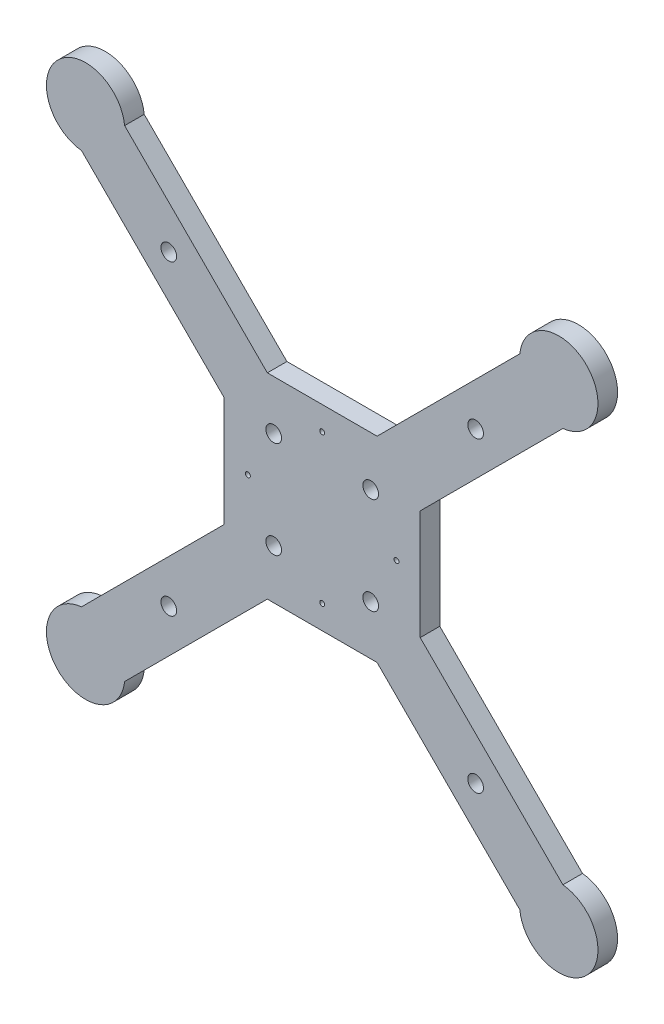
ISO-10303-21;
HEADER;
FILE_DESCRIPTION(('STEP AP214'),'2;1');
FILE_NAME('part.step','',(''),(''),'','','');
FILE_SCHEMA(('AUTOMOTIVE_DESIGN { 1 0 10303 214 1 1 1 1 }'));
ENDSEC;
DATA;
#1=APPLICATION_CONTEXT('core data for automotive mechanical design processes');
#2=APPLICATION_PROTOCOL_DEFINITION('international standard','automotive_design',2000,#1);
#3=PRODUCT_CONTEXT('',#1,'mechanical');
#4=PRODUCT('Part','Part','',(#3));
#5=PRODUCT_RELATED_PRODUCT_CATEGORY('part','',(#4));
#6=PRODUCT_DEFINITION_FORMATION('','',#4);
#7=PRODUCT_DEFINITION_CONTEXT('part definition',#1,'design');
#8=PRODUCT_DEFINITION('design','',#6,#7);
#9=PRODUCT_DEFINITION_SHAPE('','',#8);
#10=(LENGTH_UNIT() NAMED_UNIT(*) SI_UNIT(.MILLI.,.METRE.));
#11=(NAMED_UNIT(*) PLANE_ANGLE_UNIT() SI_UNIT($,.RADIAN.));
#12=(NAMED_UNIT(*) SI_UNIT($,.STERADIAN.) SOLID_ANGLE_UNIT());
#13=UNCERTAINTY_MEASURE_WITH_UNIT(LENGTH_MEASURE(1.E-05),#10,'distance_accuracy_value','');
#14=(GEOMETRIC_REPRESENTATION_CONTEXT(3) GLOBAL_UNCERTAINTY_ASSIGNED_CONTEXT((#13)) GLOBAL_UNIT_ASSIGNED_CONTEXT((#10,
#11,#12)) REPRESENTATION_CONTEXT('',''));
#15=CARTESIAN_POINT('',(0.,0.,0.));
#16=DIRECTION('',(0.,0.,1.));
#17=DIRECTION('',(1.,0.,0.));
#18=AXIS2_PLACEMENT_3D('',#15,#16,#17);
#19=CARTESIAN_POINT('',(120.710678118655,120.710678118654,10.));
#20=DIRECTION('',(0.,0.,-1.));
#21=DIRECTION('',(-1.,0.,0.));
#22=AXIS2_PLACEMENT_3D('',#19,#20,#21);
#23=CYLINDRICAL_SURFACE('',#22,20.0000000000001);
#24=CARTESIAN_POINT('',(120.710678118655,120.710678118654,0.));
#25=DIRECTION('',(0.,0.,1.));
#26=DIRECTION('',(1.,0.,0.));
#27=AXIS2_PLACEMENT_3D('',#24,#25,#26);
#28=CIRCLE('',#27,20.0000000000001);
#29=CARTESIAN_POINT('',(122.822483701339,100.822483701339,0.));
#30=VERTEX_POINT('',#29);
#31=CARTESIAN_POINT('',(100.822483701339,122.822483701339,0.));
#32=VERTEX_POINT('',#31);
#33=EDGE_CURVE('E392',#30,#32,#28,.T.);
#34=ORIENTED_EDGE('',*,*,#33,.T.);
#35=DIRECTION('',(0.,0.,-1.));
#36=VECTOR('',#35,1.);
#37=CARTESIAN_POINT('',(100.822483701339,122.822483701339,10.));
#38=LINE('',#37,#36);
#39=CARTESIAN_POINT('',(100.822483701339,122.822483701339,10.));
#40=VERTEX_POINT('',#39);
#41=EDGE_CURVE('E185',#40,#32,#38,.T.);
#42=ORIENTED_EDGE('',*,*,#41,.F.);
#43=CARTESIAN_POINT('',(120.710678118655,120.710678118654,10.));
#44=DIRECTION('',(0.,0.,1.));
#45=DIRECTION('',(1.,0.,0.));
#46=AXIS2_PLACEMENT_3D('',#43,#44,#45);
#47=CIRCLE('',#46,20.0000000000001);
#48=CARTESIAN_POINT('',(122.822483701339,100.822483701339,10.));
#49=VERTEX_POINT('',#48);
#50=EDGE_CURVE('E383',#49,#40,#47,.T.);
#51=ORIENTED_EDGE('',*,*,#50,.F.);
#52=DIRECTION('',(0.,0.,-1.));
#53=VECTOR('',#52,1.);
#54=CARTESIAN_POINT('',(122.822483701339,100.822483701339,10.));
#55=LINE('',#54,#53);
#56=EDGE_CURVE('E12',#49,#30,#55,.T.);
#57=ORIENTED_EDGE('',*,*,#56,.T.);
#58=EDGE_LOOP('',(#34,#42,#51,#57));
#59=FACE_BOUND('',#58,.T.);
#60=ADVANCED_FACE('F175',(#59),#23,.T.);
#61=CARTESIAN_POINT('',(-11.0000000000001,11.0000000000003,10.));
#62=DIRECTION('',(-0.707106781186544,0.707106781186551,0.));
#63=DIRECTION('',(-0.707106781186551,-0.707106781186544,0.));
#64=AXIS2_PLACEMENT_3D('',#61,#62,#63);
#65=PLANE('',#64);
#66=DIRECTION('',(0.707106781186551,0.707106781186544,0.));
#67=VECTOR('',#66,1.);
#68=CARTESIAN_POINT('',(-11.0000000000001,11.0000000000003,0.));
#69=LINE('',#68,#67);
#70=CARTESIAN_POINT('',(28.,50.,0.));
#71=VERTEX_POINT('',#70);
#72=EDGE_CURVE('E384',#71,#32,#69,.T.);
#73=ORIENTED_EDGE('',*,*,#72,.F.);
#74=DIRECTION('',(0.,0.,-1.));
#75=VECTOR('',#74,1.);
#76=CARTESIAN_POINT('',(28.,50.,10.));
#77=LINE('',#76,#75);
#78=CARTESIAN_POINT('',(28.,50.,10.));
#79=VERTEX_POINT('',#78);
#80=EDGE_CURVE('E398',#79,#71,#77,.T.);
#81=ORIENTED_EDGE('',*,*,#80,.F.);
#82=DIRECTION('',(0.707106781186551,0.707106781186544,0.));
#83=VECTOR('',#82,1.);
#84=CARTESIAN_POINT('',(-11.0000000000001,11.0000000000003,10.));
#85=LINE('',#84,#83);
#86=EDGE_CURVE('E387',#79,#40,#85,.T.);
#87=ORIENTED_EDGE('',*,*,#86,.T.);
#88=ORIENTED_EDGE('',*,*,#41,.T.);
#89=EDGE_LOOP('',(#73,#81,#87,#88));
#90=FACE_BOUND('',#89,.T.);
#91=ADVANCED_FACE('F448',(#90),#65,.T.);
#92=CARTESIAN_POINT('',(10.9999999999997,-10.9999999999998,10.));
#93=DIRECTION('',(0.707106781186544,-0.707106781186551,0.));
#94=DIRECTION('',(0.707106781186551,0.707106781186544,0.));
#95=AXIS2_PLACEMENT_3D('',#92,#93,#94);
#96=PLANE('',#95);
#97=DIRECTION('',(-0.707106781186551,-0.707106781186544,0.));
#98=VECTOR('',#97,1.);
#99=CARTESIAN_POINT('',(10.9999999999997,-10.9999999999998,0.));
#100=LINE('',#99,#98);
#101=CARTESIAN_POINT('',(50.,28.,0.));
#102=VERTEX_POINT('',#101);
#103=EDGE_CURVE('E362',#30,#102,#100,.T.);
#104=ORIENTED_EDGE('',*,*,#103,.F.);
#105=ORIENTED_EDGE('',*,*,#56,.F.);
#106=DIRECTION('',(-0.707106781186551,-0.707106781186544,0.));
#107=VECTOR('',#106,1.);
#108=CARTESIAN_POINT('',(10.9999999999997,-10.9999999999998,10.));
#109=LINE('',#108,#107);
#110=CARTESIAN_POINT('',(50.,28.,10.));
#111=VERTEX_POINT('',#110);
#112=EDGE_CURVE('E380',#49,#111,#109,.T.);
#113=ORIENTED_EDGE('',*,*,#112,.T.);
#114=DIRECTION('',(0.,0.,-1.));
#115=VECTOR('',#114,1.);
#116=CARTESIAN_POINT('',(50.,28.,10.));
#117=LINE('',#116,#115);
#118=EDGE_CURVE('E194',#111,#102,#117,.T.);
#119=ORIENTED_EDGE('',*,*,#118,.T.);
#120=EDGE_LOOP('',(#104,#105,#113,#119));
#121=FACE_BOUND('',#120,.T.);
#122=ADVANCED_FACE('F453',(#121),#96,.T.);
#123=CARTESIAN_POINT('',(0.,0.,0.));
#124=DIRECTION('',(0.,0.,1.));
#125=DIRECTION('',(1.,0.,0.));
#126=AXIS2_PLACEMENT_3D('',#123,#124,#125);
#127=PLANE('',#126);
#128=CARTESIAN_POINT('',(-24.7487373415193,-24.7487373415391,0.));
#129=DIRECTION('',(0.,0.,-1.));
#130=DIRECTION('',(-1.,0.,0.));
#131=AXIS2_PLACEMENT_3D('',#128,#129,#130);
#132=CIRCLE('',#131,4.00000000000001);
#133=CARTESIAN_POINT('',(-28.7487373415193,-24.7487373415391,0.));
#134=VERTEX_POINT('',#133);
#135=EDGE_CURVE('E699',#134,#134,#132,.T.);
#136=ORIENTED_EDGE('',*,*,#135,.F.);
#137=EDGE_LOOP('',(#136));
#138=FACE_BOUND('',#137,.T.);
#139=CARTESIAN_POINT('',(78.2842712474977,-78.2842712474263,0.));
#140=DIRECTION('',(0.,0.,-1.));
#141=DIRECTION('',(-1.,0.,0.));
#142=AXIS2_PLACEMENT_3D('',#139,#140,#141);
#143=CIRCLE('',#142,4.00000000000001);
#144=CARTESIAN_POINT('',(74.2842712474976,-78.2842712474263,0.));
#145=VERTEX_POINT('',#144);
#146=EDGE_CURVE('E705',#145,#145,#143,.T.);
#147=ORIENTED_EDGE('',*,*,#146,.F.);
#148=EDGE_LOOP('',(#147));
#149=FACE_BOUND('',#148,.T.);
#150=CARTESIAN_POINT('',(24.7487373415423,-24.748737341516,0.));
#151=DIRECTION('',(0.,0.,-1.));
#152=DIRECTION('',(-1.,0.,0.));
#153=AXIS2_PLACEMENT_3D('',#150,#151,#152);
#154=CIRCLE('',#153,4.00000000000001);
#155=CARTESIAN_POINT('',(20.7487373415423,-24.748737341516,0.));
#156=VERTEX_POINT('',#155);
#157=EDGE_CURVE('E763',#156,#156,#154,.T.);
#158=ORIENTED_EDGE('',*,*,#157,.F.);
#159=EDGE_LOOP('',(#158));
#160=FACE_BOUND('',#159,.T.);
#161=CARTESIAN_POINT('',(37.92,0.,0.));
#162=DIRECTION('',(0.,0.,-1.));
#163=DIRECTION('',(-1.,0.,0.));
#164=AXIS2_PLACEMENT_3D('',#161,#162,#163);
#165=CIRCLE('',#164,1.25000000000006);
#166=CARTESIAN_POINT('',(36.6699999999999,0.,0.));
#167=VERTEX_POINT('',#166);
#168=EDGE_CURVE('E768',#167,#167,#165,.T.);
#169=ORIENTED_EDGE('',*,*,#168,.F.);
#170=EDGE_LOOP('',(#169));
#171=FACE_BOUND('',#170,.T.);
#172=CARTESIAN_POINT('',(24.7487373415259,24.7487373415324,0.));
#173=DIRECTION('',(0.,0.,-1.));
#174=DIRECTION('',(-1.,0.,0.));
#175=AXIS2_PLACEMENT_3D('',#172,#173,#174);
#176=CIRCLE('',#175,4.00000000000004);
#177=CARTESIAN_POINT('',(20.7487373415258,24.7487373415324,0.));
#178=VERTEX_POINT('',#177);
#179=EDGE_CURVE('E725',#178,#178,#176,.T.);
#180=ORIENTED_EDGE('',*,*,#179,.F.);
#181=EDGE_LOOP('',(#180));
#182=FACE_BOUND('',#181,.T.);
#183=CARTESIAN_POINT('',(-78.2842712474768,78.2842712474472,0.));
#184=DIRECTION('',(0.,0.,-1.));
#185=DIRECTION('',(-1.,0.,0.));
#186=AXIS2_PLACEMENT_3D('',#183,#184,#185);
#187=CIRCLE('',#186,3.99999999999999);
#188=CARTESIAN_POINT('',(-82.2842712474768,78.2842712474472,0.));
#189=VERTEX_POINT('',#188);
#190=EDGE_CURVE('E377',#189,#189,#187,.T.);
#191=ORIENTED_EDGE('',*,*,#190,.F.);
#192=EDGE_LOOP('',(#191));
#193=FACE_BOUND('',#192,.T.);
#194=CARTESIAN_POINT('',(-24.7487373415357,24.7487373415226,0.));
#195=DIRECTION('',(0.,0.,-1.));
#196=DIRECTION('',(-1.,0.,0.));
#197=AXIS2_PLACEMENT_3D('',#194,#195,#196);
#198=CIRCLE('',#197,4.00000000000003);
#199=CARTESIAN_POINT('',(-28.7487373415357,24.7487373415226,0.));
#200=VERTEX_POINT('',#199);
#201=EDGE_CURVE('E715',#200,#200,#198,.T.);
#202=ORIENTED_EDGE('',*,*,#201,.F.);
#203=EDGE_LOOP('',(#202));
#204=FACE_BOUND('',#203,.T.);
#205=CARTESIAN_POINT('',(-78.2842712474368,-78.2842712474872,0.));
#206=DIRECTION('',(0.,0.,-1.));
#207=DIRECTION('',(-1.,0.,0.));
#208=AXIS2_PLACEMENT_3D('',#205,#206,#207);
#209=CIRCLE('',#208,4.00000000000001);
#210=CARTESIAN_POINT('',(-82.2842712474368,-78.2842712474872,0.));
#211=VERTEX_POINT('',#210);
#212=EDGE_CURVE('E702',#211,#211,#209,.T.);
#213=ORIENTED_EDGE('',*,*,#212,.F.);
#214=EDGE_LOOP('',(#213));
#215=FACE_BOUND('',#214,.T.);
#216=CARTESIAN_POINT('',(-1.46328554356032E-13,37.92,0.));
#217=DIRECTION('',(0.,0.,-1.));
#218=DIRECTION('',(-1.,0.,0.));
#219=AXIS2_PLACEMENT_3D('',#216,#217,#218);
#220=CIRCLE('',#219,1.25000000000005);
#221=CARTESIAN_POINT('',(-1.2500000000002,37.92,0.));
#222=VERTEX_POINT('',#221);
#223=EDGE_CURVE('E743',#222,#222,#220,.T.);
#224=ORIENTED_EDGE('',*,*,#223,.F.);
#225=EDGE_LOOP('',(#224));
#226=FACE_BOUND('',#225,.T.);
#227=CARTESIAN_POINT('',(-37.92,-2.87145458143721E-13,0.));
#228=DIRECTION('',(0.,0.,-1.));
#229=DIRECTION('',(-1.,0.,0.));
#230=AXIS2_PLACEMENT_3D('',#227,#228,#229);
#231=CIRCLE('',#230,1.25);
#232=CARTESIAN_POINT('',(-39.17,-2.87145458143721E-13,0.));
#233=VERTEX_POINT('',#232);
#234=EDGE_CURVE('E747',#233,#233,#231,.T.);
#235=ORIENTED_EDGE('',*,*,#234,.F.);
#236=EDGE_LOOP('',(#235));
#237=FACE_BOUND('',#236,.T.);
#238=CARTESIAN_POINT('',(4.36382293350167E-13,-37.92,0.));
#239=DIRECTION('',(0.,0.,-1.));
#240=DIRECTION('',(-1.,0.,0.));
#241=AXIS2_PLACEMENT_3D('',#238,#239,#240);
#242=CIRCLE('',#241,1.25);
#243=CARTESIAN_POINT('',(-1.24999999999956,-37.92,0.));
#244=VERTEX_POINT('',#243);
#245=EDGE_CURVE('E751',#244,#244,#242,.T.);
#246=ORIENTED_EDGE('',*,*,#245,.F.);
#247=EDGE_LOOP('',(#246));
#248=FACE_BOUND('',#247,.T.);
#249=CARTESIAN_POINT('',(78.2842712474577,78.2842712474663,0.));
#250=DIRECTION('',(0.,0.,-1.));
#251=DIRECTION('',(-1.,0.,0.));
#252=AXIS2_PLACEMENT_3D('',#249,#250,#251);
#253=CIRCLE('',#252,4.00000000000008);
#254=CARTESIAN_POINT('',(74.2842712474576,78.2842712474663,0.));
#255=VERTEX_POINT('',#254);
#256=EDGE_CURVE('E369',#255,#255,#253,.T.);
#257=ORIENTED_EDGE('',*,*,#256,.F.);
#258=EDGE_LOOP('',(#257));
#259=FACE_BOUND('',#258,.T.);
#260=DIRECTION('',(0.,1.,0.));
#261=VECTOR('',#260,1.);
#262=CARTESIAN_POINT('',(50.,-50.,0.));
#263=LINE('',#262,#261);
#264=CARTESIAN_POINT('',(50.,-28.,0.));
#265=VERTEX_POINT('',#264);
#266=EDGE_CURVE('E179',#265,#102,#263,.T.);
#267=ORIENTED_EDGE('',*,*,#266,.F.);
#268=DIRECTION('',(-0.707106781186562,0.707106781186533,0.));
#269=VECTOR('',#268,1.);
#270=CARTESIAN_POINT('',(10.999999999999,10.9999999999994,0.));
#271=LINE('',#270,#269);
#272=CARTESIAN_POINT('',(122.822483701341,-100.822483701338,0.));
#273=VERTEX_POINT('',#272);
#274=EDGE_CURVE('E325',#273,#265,#271,.T.);
#275=ORIENTED_EDGE('',*,*,#274,.F.);
#276=CARTESIAN_POINT('',(120.710678118656,-120.710678118653,0.));
#277=DIRECTION('',(0.,0.,1.));
#278=DIRECTION('',(1.,0.,0.));
#279=AXIS2_PLACEMENT_3D('',#276,#277,#278);
#280=CIRCLE('',#279,19.9999999999999);
#281=CARTESIAN_POINT('',(100.822483701341,-122.822483701338,0.));
#282=VERTEX_POINT('',#281);
#283=EDGE_CURVE('E323',#282,#273,#280,.T.);
#284=ORIENTED_EDGE('',*,*,#283,.F.);
#285=DIRECTION('',(0.707106781186562,-0.707106781186534,0.));
#286=VECTOR('',#285,1.);
#287=CARTESIAN_POINT('',(-11.0000000000006,-11.000000000001,0.));
#288=LINE('',#287,#286);
#289=CARTESIAN_POINT('',(28.,-50.,0.));
#290=VERTEX_POINT('',#289);
#291=EDGE_CURVE('E321',#290,#282,#288,.T.);
#292=ORIENTED_EDGE('',*,*,#291,.F.);
#293=DIRECTION('',(-1.,0.,0.));
#294=VECTOR('',#293,1.);
#295=CARTESIAN_POINT('',(0.,-50.,0.));
#296=LINE('',#295,#294);
#297=CARTESIAN_POINT('',(-28.,-50.,0.));
#298=VERTEX_POINT('',#297);
#299=EDGE_CURVE('E313',#290,#298,#296,.T.);
#300=ORIENTED_EDGE('',*,*,#299,.T.);
#301=DIRECTION('',(0.707106781186551,0.707106781186544,0.));
#302=VECTOR('',#301,1.);
#303=CARTESIAN_POINT('',(11.0000000000001,-11.0000000000002,0.));
#304=LINE('',#303,#302);
#305=CARTESIAN_POINT('',(-100.82248370134,-122.822483701339,0.));
#306=VERTEX_POINT('',#305);
#307=EDGE_CURVE('E309',#306,#298,#304,.T.);
#308=ORIENTED_EDGE('',*,*,#307,.F.);
#309=CARTESIAN_POINT('',(-120.710678118655,-120.710678118654,0.));
#310=DIRECTION('',(0.,0.,1.));
#311=DIRECTION('',(1.,0.,0.));
#312=AXIS2_PLACEMENT_3D('',#309,#310,#311);
#313=CIRCLE('',#312,20.);
#314=CARTESIAN_POINT('',(-122.822483701339,-100.822483701339,0.));
#315=VERTEX_POINT('',#314);
#316=EDGE_CURVE('E301',#315,#306,#313,.T.);
#317=ORIENTED_EDGE('',*,*,#316,.F.);
#318=DIRECTION('',(-0.707106781186551,-0.707106781186544,0.));
#319=VECTOR('',#318,1.);
#320=CARTESIAN_POINT('',(-10.9999999999997,10.9999999999999,0.));
#321=LINE('',#320,#319);
#322=CARTESIAN_POINT('',(-50.,-28.,0.));
#323=VERTEX_POINT('',#322);
#324=EDGE_CURVE('E285',#323,#315,#321,.T.);
#325=ORIENTED_EDGE('',*,*,#324,.F.);
#326=DIRECTION('',(0.,1.,0.));
#327=VECTOR('',#326,1.);
#328=CARTESIAN_POINT('',(-50.,0.,0.));
#329=LINE('',#328,#327);
#330=CARTESIAN_POINT('',(-50.,28.,0.));
#331=VERTEX_POINT('',#330);
#332=EDGE_CURVE('E295',#323,#331,#329,.T.);
#333=ORIENTED_EDGE('',*,*,#332,.T.);
#334=DIRECTION('',(-0.707106781186561,0.707106781186534,0.));
#335=VECTOR('',#334,1.);
#336=CARTESIAN_POINT('',(-10.999999999999,-10.9999999999995,0.));
#337=LINE('',#336,#335);
#338=CARTESIAN_POINT('',(-122.82248370134,100.822483701338,0.));
#339=VERTEX_POINT('',#338);
#340=EDGE_CURVE('E334',#331,#339,#337,.T.);
#341=ORIENTED_EDGE('',*,*,#340,.T.);
#342=CARTESIAN_POINT('',(-120.710678118656,120.710678118653,0.));
#343=DIRECTION('',(0.,0.,1.));
#344=DIRECTION('',(1.,0.,0.));
#345=AXIS2_PLACEMENT_3D('',#342,#343,#344);
#346=CIRCLE('',#345,20.);
#347=CARTESIAN_POINT('',(-100.822483701341,122.822483701338,0.));
#348=VERTEX_POINT('',#347);
#349=EDGE_CURVE('E331',#348,#339,#346,.T.);
#350=ORIENTED_EDGE('',*,*,#349,.F.);
#351=DIRECTION('',(0.707106781186562,-0.707106781186534,0.));
#352=VECTOR('',#351,1.);
#353=CARTESIAN_POINT('',(11.0000000000005,11.000000000001,0.));
#354=LINE('',#353,#352);
#355=CARTESIAN_POINT('',(-28.,50.,0.));
#356=VERTEX_POINT('',#355);
#357=EDGE_CURVE('E328',#348,#356,#354,.T.);
#358=ORIENTED_EDGE('',*,*,#357,.T.);
#359=DIRECTION('',(-1.,0.,0.));
#360=VECTOR('',#359,1.);
#361=CARTESIAN_POINT('',(50.,50.,0.));
#362=LINE('',#361,#360);
#363=EDGE_CURVE('E363',#71,#356,#362,.T.);
#364=ORIENTED_EDGE('',*,*,#363,.F.);
#365=ORIENTED_EDGE('',*,*,#72,.T.);
#366=ORIENTED_EDGE('',*,*,#33,.F.);
#367=ORIENTED_EDGE('',*,*,#103,.T.);
#368=EDGE_LOOP('',(#267,#275,#284,#292,#300,#308,#317,#325,#333,#341,#350,#358,#364,#365,#366,#367));
#369=FACE_BOUND('',#368,.T.);
#370=ADVANCED_FACE('F306',(#138,#149,#160,#171,#182,#193,#204,#215,#226,#237,#248,#259,#369),
#127,.F.);
#371=CARTESIAN_POINT('',(0.,0.,10.));
#372=DIRECTION('',(0.,0.,1.));
#373=DIRECTION('',(1.,0.,0.));
#374=AXIS2_PLACEMENT_3D('',#371,#372,#373);
#375=PLANE('',#374);
#376=CARTESIAN_POINT('',(-24.7487373415193,-24.7487373415391,10.));
#377=DIRECTION('',(0.,0.,-1.));
#378=DIRECTION('',(-1.,0.,0.));
#379=AXIS2_PLACEMENT_3D('',#376,#377,#378);
#380=CIRCLE('',#379,4.00000000000001);
#381=CARTESIAN_POINT('',(-28.7487373415193,-24.7487373415391,10.));
#382=VERTEX_POINT('',#381);
#383=EDGE_CURVE('E696',#382,#382,#380,.T.);
#384=ORIENTED_EDGE('',*,*,#383,.T.);
#385=EDGE_LOOP('',(#384));
#386=FACE_BOUND('',#385,.T.);
#387=CARTESIAN_POINT('',(78.2842712474977,-78.2842712474263,10.));
#388=DIRECTION('',(0.,0.,-1.));
#389=DIRECTION('',(-1.,0.,0.));
#390=AXIS2_PLACEMENT_3D('',#387,#388,#389);
#391=CIRCLE('',#390,4.00000000000001);
#392=CARTESIAN_POINT('',(74.2842712474976,-78.2842712474263,10.));
#393=VERTEX_POINT('',#392);
#394=EDGE_CURVE('E700',#393,#393,#391,.T.);
#395=ORIENTED_EDGE('',*,*,#394,.T.);
#396=EDGE_LOOP('',(#395));
#397=FACE_BOUND('',#396,.T.);
#398=CARTESIAN_POINT('',(24.7487373415423,-24.748737341516,10.));
#399=DIRECTION('',(0.,0.,-1.));
#400=DIRECTION('',(-1.,0.,0.));
#401=AXIS2_PLACEMENT_3D('',#398,#399,#400);
#402=CIRCLE('',#401,4.00000000000001);
#403=CARTESIAN_POINT('',(20.7487373415423,-24.748737341516,10.));
#404=VERTEX_POINT('',#403);
#405=EDGE_CURVE('E711',#404,#404,#402,.T.);
#406=ORIENTED_EDGE('',*,*,#405,.T.);
#407=EDGE_LOOP('',(#406));
#408=FACE_BOUND('',#407,.T.);
#409=CARTESIAN_POINT('',(37.92,0.,10.));
#410=DIRECTION('',(0.,0.,-1.));
#411=DIRECTION('',(-1.,0.,0.));
#412=AXIS2_PLACEMENT_3D('',#409,#410,#411);
#413=CIRCLE('',#412,1.25000000000006);
#414=CARTESIAN_POINT('',(36.6699999999999,0.,10.));
#415=VERTEX_POINT('',#414);
#416=EDGE_CURVE('E766',#415,#415,#413,.T.);
#417=ORIENTED_EDGE('',*,*,#416,.T.);
#418=EDGE_LOOP('',(#417));
#419=FACE_BOUND('',#418,.T.);
#420=CARTESIAN_POINT('',(24.7487373415259,24.7487373415324,10.));
#421=DIRECTION('',(0.,0.,-1.));
#422=DIRECTION('',(-1.,0.,0.));
#423=AXIS2_PLACEMENT_3D('',#420,#421,#422);
#424=CIRCLE('',#423,4.00000000000004);
#425=CARTESIAN_POINT('',(20.7487373415258,24.7487373415324,10.));
#426=VERTEX_POINT('',#425);
#427=EDGE_CURVE('E374',#426,#426,#424,.T.);
#428=ORIENTED_EDGE('',*,*,#427,.T.);
#429=EDGE_LOOP('',(#428));
#430=FACE_BOUND('',#429,.T.);
#431=CARTESIAN_POINT('',(-78.2842712474768,78.2842712474472,10.));
#432=DIRECTION('',(0.,0.,-1.));
#433=DIRECTION('',(-1.,0.,0.));
#434=AXIS2_PLACEMENT_3D('',#431,#432,#433);
#435=CIRCLE('',#434,3.99999999999999);
#436=CARTESIAN_POINT('',(-82.2842712474768,78.2842712474472,10.));
#437=VERTEX_POINT('',#436);
#438=EDGE_CURVE('E727',#437,#437,#435,.T.);
#439=ORIENTED_EDGE('',*,*,#438,.T.);
#440=EDGE_LOOP('',(#439));
#441=FACE_BOUND('',#440,.T.);
#442=CARTESIAN_POINT('',(-24.7487373415357,24.7487373415226,10.));
#443=DIRECTION('',(0.,0.,-1.));
#444=DIRECTION('',(-1.,0.,0.));
#445=AXIS2_PLACEMENT_3D('',#442,#443,#444);
#446=CIRCLE('',#445,4.00000000000003);
#447=CARTESIAN_POINT('',(-28.7487373415357,24.7487373415226,10.));
#448=VERTEX_POINT('',#447);
#449=EDGE_CURVE('E712',#448,#448,#446,.T.);
#450=ORIENTED_EDGE('',*,*,#449,.T.);
#451=EDGE_LOOP('',(#450));
#452=FACE_BOUND('',#451,.T.);
#453=CARTESIAN_POINT('',(-78.2842712474368,-78.2842712474872,10.));
#454=DIRECTION('',(0.,0.,-1.));
#455=DIRECTION('',(-1.,0.,0.));
#456=AXIS2_PLACEMENT_3D('',#453,#454,#455);
#457=CIRCLE('',#456,4.00000000000001);
#458=CARTESIAN_POINT('',(-82.2842712474368,-78.2842712474872,10.));
#459=VERTEX_POINT('',#458);
#460=EDGE_CURVE('E718',#459,#459,#457,.T.);
#461=ORIENTED_EDGE('',*,*,#460,.T.);
#462=EDGE_LOOP('',(#461));
#463=FACE_BOUND('',#462,.T.);
#464=CARTESIAN_POINT('',(-1.46328554356032E-13,37.92,10.));
#465=DIRECTION('',(0.,0.,-1.));
#466=DIRECTION('',(-1.,0.,0.));
#467=AXIS2_PLACEMENT_3D('',#464,#465,#466);
#468=CIRCLE('',#467,1.25000000000005);
#469=CARTESIAN_POINT('',(-1.2500000000002,37.92,10.));
#470=VERTEX_POINT('',#469);
#471=EDGE_CURVE('E770',#470,#470,#468,.T.);
#472=ORIENTED_EDGE('',*,*,#471,.T.);
#473=EDGE_LOOP('',(#472));
#474=FACE_BOUND('',#473,.T.);
#475=CARTESIAN_POINT('',(-37.92,-2.87145458143721E-13,10.));
#476=DIRECTION('',(0.,0.,-1.));
#477=DIRECTION('',(-1.,0.,0.));
#478=AXIS2_PLACEMENT_3D('',#475,#476,#477);
#479=CIRCLE('',#478,1.25);
#480=CARTESIAN_POINT('',(-39.17,-2.87145458143721E-13,10.));
#481=VERTEX_POINT('',#480);
#482=EDGE_CURVE('E777',#481,#481,#479,.T.);
#483=ORIENTED_EDGE('',*,*,#482,.T.);
#484=EDGE_LOOP('',(#483));
#485=FACE_BOUND('',#484,.T.);
#486=CARTESIAN_POINT('',(4.36382293350167E-13,-37.92,10.));
#487=DIRECTION('',(0.,0.,-1.));
#488=DIRECTION('',(-1.,0.,0.));
#489=AXIS2_PLACEMENT_3D('',#486,#487,#488);
#490=CIRCLE('',#489,1.25);
#491=CARTESIAN_POINT('',(-1.24999999999956,-37.92,10.));
#492=VERTEX_POINT('',#491);
#493=EDGE_CURVE('E755',#492,#492,#490,.T.);
#494=ORIENTED_EDGE('',*,*,#493,.T.);
#495=EDGE_LOOP('',(#494));
#496=FACE_BOUND('',#495,.T.);
#497=CARTESIAN_POINT('',(78.2842712474577,78.2842712474663,10.));
#498=DIRECTION('',(0.,0.,-1.));
#499=DIRECTION('',(-1.,0.,0.));
#500=AXIS2_PLACEMENT_3D('',#497,#498,#499);
#501=CIRCLE('',#500,4.00000000000008);
#502=CARTESIAN_POINT('',(74.2842712474576,78.2842712474663,10.));
#503=VERTEX_POINT('',#502);
#504=EDGE_CURVE('E364',#503,#503,#501,.T.);
#505=ORIENTED_EDGE('',*,*,#504,.T.);
#506=EDGE_LOOP('',(#505));
#507=FACE_BOUND('',#506,.T.);
#508=DIRECTION('',(-0.707106781186562,0.707106781186533,0.));
#509=VECTOR('',#508,1.);
#510=CARTESIAN_POINT('',(10.999999999999,10.9999999999994,10.));
#511=LINE('',#510,#509);
#512=CARTESIAN_POINT('',(122.822483701341,-100.822483701338,10.));
#513=VERTEX_POINT('',#512);
#514=CARTESIAN_POINT('',(50.,-28.,10.));
#515=VERTEX_POINT('',#514);
#516=EDGE_CURVE('E412',#513,#515,#511,.T.);
#517=ORIENTED_EDGE('',*,*,#516,.T.);
#518=DIRECTION('',(0.,1.,0.));
#519=VECTOR('',#518,1.);
#520=CARTESIAN_POINT('',(50.,-50.,10.));
#521=LINE('',#520,#519);
#522=EDGE_CURVE('E311',#515,#111,#521,.T.);
#523=ORIENTED_EDGE('',*,*,#522,.T.);
#524=ORIENTED_EDGE('',*,*,#112,.F.);
#525=ORIENTED_EDGE('',*,*,#50,.T.);
#526=ORIENTED_EDGE('',*,*,#86,.F.);
#527=DIRECTION('',(-1.,0.,0.));
#528=VECTOR('',#527,1.);
#529=CARTESIAN_POINT('',(50.,50.,10.));
#530=LINE('',#529,#528);
#531=CARTESIAN_POINT('',(-28.,50.,10.));
#532=VERTEX_POINT('',#531);
#533=EDGE_CURVE('E315',#79,#532,#530,.T.);
#534=ORIENTED_EDGE('',*,*,#533,.T.);
#535=DIRECTION('',(0.707106781186562,-0.707106781186534,0.));
#536=VECTOR('',#535,1.);
#537=CARTESIAN_POINT('',(11.0000000000005,11.000000000001,10.));
#538=LINE('',#537,#536);
#539=CARTESIAN_POINT('',(-100.822483701341,122.822483701338,10.));
#540=VERTEX_POINT('',#539);
#541=EDGE_CURVE('E415',#540,#532,#538,.T.);
#542=ORIENTED_EDGE('',*,*,#541,.F.);
#543=CARTESIAN_POINT('',(-120.710678118656,120.710678118653,10.));
#544=DIRECTION('',(0.,0.,1.));
#545=DIRECTION('',(1.,0.,0.));
#546=AXIS2_PLACEMENT_3D('',#543,#544,#545);
#547=CIRCLE('',#546,20.);
#548=CARTESIAN_POINT('',(-122.82248370134,100.822483701338,10.));
#549=VERTEX_POINT('',#548);
#550=EDGE_CURVE('E418',#540,#549,#547,.T.);
#551=ORIENTED_EDGE('',*,*,#550,.T.);
#552=DIRECTION('',(-0.707106781186561,0.707106781186534,0.));
#553=VECTOR('',#552,1.);
#554=CARTESIAN_POINT('',(-10.999999999999,-10.9999999999995,10.));
#555=LINE('',#554,#553);
#556=CARTESIAN_POINT('',(-50.,28.,10.));
#557=VERTEX_POINT('',#556);
#558=EDGE_CURVE('E420',#557,#549,#555,.T.);
#559=ORIENTED_EDGE('',*,*,#558,.F.);
#560=DIRECTION('',(0.,1.,0.));
#561=VECTOR('',#560,1.);
#562=CARTESIAN_POINT('',(-50.,0.,10.));
#563=LINE('',#562,#561);
#564=CARTESIAN_POINT('',(-50.,-28.,10.));
#565=VERTEX_POINT('',#564);
#566=EDGE_CURVE('E422',#565,#557,#563,.T.);
#567=ORIENTED_EDGE('',*,*,#566,.F.);
#568=DIRECTION('',(-0.707106781186551,-0.707106781186544,0.));
#569=VECTOR('',#568,1.);
#570=CARTESIAN_POINT('',(-10.9999999999997,10.9999999999999,10.));
#571=LINE('',#570,#569);
#572=CARTESIAN_POINT('',(-122.822483701339,-100.822483701339,10.));
#573=VERTEX_POINT('',#572);
#574=EDGE_CURVE('E303',#565,#573,#571,.T.);
#575=ORIENTED_EDGE('',*,*,#574,.T.);
#576=CARTESIAN_POINT('',(-120.710678118655,-120.710678118654,10.));
#577=DIRECTION('',(0.,0.,1.));
#578=DIRECTION('',(1.,0.,0.));
#579=AXIS2_PLACEMENT_3D('',#576,#577,#578);
#580=CIRCLE('',#579,20.);
#581=CARTESIAN_POINT('',(-100.82248370134,-122.822483701339,10.));
#582=VERTEX_POINT('',#581);
#583=EDGE_CURVE('E294',#573,#582,#580,.T.);
#584=ORIENTED_EDGE('',*,*,#583,.T.);
#585=DIRECTION('',(0.707106781186551,0.707106781186544,0.));
#586=VECTOR('',#585,1.);
#587=CARTESIAN_POINT('',(11.0000000000001,-11.0000000000002,10.));
#588=LINE('',#587,#586);
#589=CARTESIAN_POINT('',(-28.,-50.,10.));
#590=VERTEX_POINT('',#589);
#591=EDGE_CURVE('E402',#582,#590,#588,.T.);
#592=ORIENTED_EDGE('',*,*,#591,.T.);
#593=DIRECTION('',(-1.,0.,0.));
#594=VECTOR('',#593,1.);
#595=CARTESIAN_POINT('',(0.,-50.,10.));
#596=LINE('',#595,#594);
#597=CARTESIAN_POINT('',(28.,-50.,10.));
#598=VERTEX_POINT('',#597);
#599=EDGE_CURVE('E405',#598,#590,#596,.T.);
#600=ORIENTED_EDGE('',*,*,#599,.F.);
#601=DIRECTION('',(0.707106781186562,-0.707106781186534,0.));
#602=VECTOR('',#601,1.);
#603=CARTESIAN_POINT('',(-11.0000000000006,-11.000000000001,10.));
#604=LINE('',#603,#602);
#605=CARTESIAN_POINT('',(100.822483701341,-122.822483701338,10.));
#606=VERTEX_POINT('',#605);
#607=EDGE_CURVE('E408',#598,#606,#604,.T.);
#608=ORIENTED_EDGE('',*,*,#607,.T.);
#609=CARTESIAN_POINT('',(120.710678118656,-120.710678118653,10.));
#610=DIRECTION('',(0.,0.,1.));
#611=DIRECTION('',(1.,0.,0.));
#612=AXIS2_PLACEMENT_3D('',#609,#610,#611);
#613=CIRCLE('',#612,19.9999999999999);
#614=EDGE_CURVE('E410',#606,#513,#613,.T.);
#615=ORIENTED_EDGE('',*,*,#614,.T.);
#616=EDGE_LOOP('',(#517,#523,#524,#525,#526,#534,#542,#551,#559,#567,#575,#584,#592,#600,#608,#615));
#617=FACE_BOUND('',#616,.T.);
#618=ADVANCED_FACE('F427',(#386,#397,#408,#419,#430,#441,#452,#463,#474,#485,#496,#507,#617),
#375,.T.);
#619=CARTESIAN_POINT('',(-120.710678118655,-120.710678118654,10.));
#620=DIRECTION('',(0.,0.,-1.));
#621=DIRECTION('',(-1.,0.,0.));
#622=AXIS2_PLACEMENT_3D('',#619,#620,#621);
#623=CYLINDRICAL_SURFACE('',#622,20.);
#624=ORIENTED_EDGE('',*,*,#316,.T.);
#625=DIRECTION('',(0.,0.,-1.));
#626=VECTOR('',#625,1.);
#627=CARTESIAN_POINT('',(-100.82248370134,-122.822483701339,10.));
#628=LINE('',#627,#626);
#629=EDGE_CURVE('E360',#582,#306,#628,.T.);
#630=ORIENTED_EDGE('',*,*,#629,.F.);
#631=ORIENTED_EDGE('',*,*,#583,.F.);
#632=DIRECTION('',(0.,0.,-1.));
#633=VECTOR('',#632,1.);
#634=CARTESIAN_POINT('',(-122.822483701339,-100.822483701339,10.));
#635=LINE('',#634,#633);
#636=EDGE_CURVE('E288',#573,#315,#635,.T.);
#637=ORIENTED_EDGE('',*,*,#636,.T.);
#638=EDGE_LOOP('',(#624,#630,#631,#637));
#639=FACE_BOUND('',#638,.T.);
#640=ADVANCED_FACE('F299',(#639),#623,.T.);
#641=CARTESIAN_POINT('',(-10.9999999999997,10.9999999999999,10.));
#642=DIRECTION('',(0.707106781186544,-0.707106781186551,0.));
#643=DIRECTION('',(0.707106781186551,0.707106781186544,0.));
#644=AXIS2_PLACEMENT_3D('',#641,#642,#643);
#645=PLANE('',#644);
#646=ORIENTED_EDGE('',*,*,#324,.T.);
#647=ORIENTED_EDGE('',*,*,#636,.F.);
#648=ORIENTED_EDGE('',*,*,#574,.F.);
#649=DIRECTION('',(0.,0.,-1.));
#650=VECTOR('',#649,1.);
#651=CARTESIAN_POINT('',(-50.,-28.,10.));
#652=LINE('',#651,#650);
#653=EDGE_CURVE('E282',#565,#323,#652,.T.);
#654=ORIENTED_EDGE('',*,*,#653,.T.);
#655=EDGE_LOOP('',(#646,#647,#648,#654));
#656=FACE_BOUND('',#655,.T.);
#657=ADVANCED_FACE('F287',(#656),#645,.F.);
#658=CARTESIAN_POINT('',(11.0000000000001,-11.0000000000002,10.));
#659=DIRECTION('',(-0.707106781186544,0.707106781186551,0.));
#660=DIRECTION('',(-0.707106781186551,-0.707106781186544,0.));
#661=AXIS2_PLACEMENT_3D('',#658,#659,#660);
#662=PLANE('',#661);
#663=ORIENTED_EDGE('',*,*,#307,.T.);
#664=DIRECTION('',(0.,0.,-1.));
#665=VECTOR('',#664,1.);
#666=CARTESIAN_POINT('',(-28.,-50.,10.));
#667=LINE('',#666,#665);
#668=EDGE_CURVE('E358',#590,#298,#667,.T.);
#669=ORIENTED_EDGE('',*,*,#668,.F.);
#670=ORIENTED_EDGE('',*,*,#591,.F.);
#671=ORIENTED_EDGE('',*,*,#629,.T.);
#672=EDGE_LOOP('',(#663,#669,#670,#671));
#673=FACE_BOUND('',#672,.T.);
#674=ADVANCED_FACE('F475',(#673),#662,.F.);
#675=CARTESIAN_POINT('',(-120.710678118656,120.710678118653,10.));
#676=DIRECTION('',(0.,0.,-1.));
#677=DIRECTION('',(-1.,0.,0.));
#678=AXIS2_PLACEMENT_3D('',#675,#676,#677);
#679=CYLINDRICAL_SURFACE('',#678,20.);
#680=ORIENTED_EDGE('',*,*,#349,.T.);
#681=DIRECTION('',(0.,0.,-1.));
#682=VECTOR('',#681,1.);
#683=CARTESIAN_POINT('',(-122.82248370134,100.822483701338,10.));
#684=LINE('',#683,#682);
#685=EDGE_CURVE('E341',#549,#339,#684,.T.);
#686=ORIENTED_EDGE('',*,*,#685,.F.);
#687=ORIENTED_EDGE('',*,*,#550,.F.);
#688=DIRECTION('',(0.,0.,-1.));
#689=VECTOR('',#688,1.);
#690=CARTESIAN_POINT('',(-100.822483701341,122.822483701338,10.));
#691=LINE('',#690,#689);
#692=EDGE_CURVE('E343',#540,#348,#691,.T.);
#693=ORIENTED_EDGE('',*,*,#692,.T.);
#694=EDGE_LOOP('',(#680,#686,#687,#693));
#695=FACE_BOUND('',#694,.T.);
#696=ADVANCED_FACE('F502',(#695),#679,.T.);
#697=CARTESIAN_POINT('',(-10.999999999999,-10.9999999999995,10.));
#698=DIRECTION('',(-0.707106781186534,-0.707106781186561,0.));
#699=DIRECTION('',(0.707106781186561,-0.707106781186534,0.));
#700=AXIS2_PLACEMENT_3D('',#697,#698,#699);
#701=PLANE('',#700);
#702=ORIENTED_EDGE('',*,*,#340,.F.);
#703=DIRECTION('',(0.,0.,-1.));
#704=VECTOR('',#703,1.);
#705=CARTESIAN_POINT('',(-50.,28.,10.));
#706=LINE('',#705,#704);
#707=EDGE_CURVE('E339',#557,#331,#706,.T.);
#708=ORIENTED_EDGE('',*,*,#707,.F.);
#709=ORIENTED_EDGE('',*,*,#558,.T.);
#710=ORIENTED_EDGE('',*,*,#685,.T.);
#711=EDGE_LOOP('',(#702,#708,#709,#710));
#712=FACE_BOUND('',#711,.T.);
#713=ADVANCED_FACE('F434',(#712),#701,.T.);
#714=CARTESIAN_POINT('',(-50.,0.,10.));
#715=DIRECTION('',(-1.,0.,0.));
#716=DIRECTION('',(0.,-1.,0.));
#717=AXIS2_PLACEMENT_3D('',#714,#715,#716);
#718=PLANE('',#717);
#719=ORIENTED_EDGE('',*,*,#332,.F.);
#720=ORIENTED_EDGE('',*,*,#653,.F.);
#721=ORIENTED_EDGE('',*,*,#566,.T.);
#722=ORIENTED_EDGE('',*,*,#707,.T.);
#723=EDGE_LOOP('',(#719,#720,#721,#722));
#724=FACE_BOUND('',#723,.T.);
#725=ADVANCED_FACE('F435',(#724),#718,.T.);
#726=CARTESIAN_POINT('',(0.,-50.,10.));
#727=DIRECTION('',(0.,-1.,0.));
#728=DIRECTION('',(1.,0.,0.));
#729=AXIS2_PLACEMENT_3D('',#726,#727,#728);
#730=PLANE('',#729);
#731=ORIENTED_EDGE('',*,*,#299,.F.);
#732=DIRECTION('',(0.,0.,-1.));
#733=VECTOR('',#732,1.);
#734=CARTESIAN_POINT('',(28.,-50.,10.));
#735=LINE('',#734,#733);
#736=EDGE_CURVE('E356',#598,#290,#735,.T.);
#737=ORIENTED_EDGE('',*,*,#736,.F.);
#738=ORIENTED_EDGE('',*,*,#599,.T.);
#739=ORIENTED_EDGE('',*,*,#668,.T.);
#740=EDGE_LOOP('',(#731,#737,#738,#739));
#741=FACE_BOUND('',#740,.T.);
#742=ADVANCED_FACE('F471',(#741),#730,.T.);
#743=CARTESIAN_POINT('',(120.710678118656,-120.710678118653,10.));
#744=DIRECTION('',(0.,0.,-1.));
#745=DIRECTION('',(-1.,0.,0.));
#746=AXIS2_PLACEMENT_3D('',#743,#744,#745);
#747=CYLINDRICAL_SURFACE('',#746,19.9999999999999);
#748=ORIENTED_EDGE('',*,*,#283,.T.);
#749=DIRECTION('',(0.,0.,-1.));
#750=VECTOR('',#749,1.);
#751=CARTESIAN_POINT('',(122.822483701341,-100.822483701338,10.));
#752=LINE('',#751,#750);
#753=EDGE_CURVE('E350',#513,#273,#752,.T.);
#754=ORIENTED_EDGE('',*,*,#753,.F.);
#755=ORIENTED_EDGE('',*,*,#614,.F.);
#756=DIRECTION('',(0.,0.,-1.));
#757=VECTOR('',#756,1.);
#758=CARTESIAN_POINT('',(100.822483701341,-122.822483701338,10.));
#759=LINE('',#758,#757);
#760=EDGE_CURVE('E353',#606,#282,#759,.T.);
#761=ORIENTED_EDGE('',*,*,#760,.T.);
#762=EDGE_LOOP('',(#748,#754,#755,#761));
#763=FACE_BOUND('',#762,.T.);
#764=ADVANCED_FACE('F465',(#763),#747,.T.);
#765=CARTESIAN_POINT('',(-11.0000000000006,-11.000000000001,10.));
#766=DIRECTION('',(0.707106781186534,0.707106781186562,0.));
#767=DIRECTION('',(-0.707106781186562,0.707106781186534,0.));
#768=AXIS2_PLACEMENT_3D('',#765,#766,#767);
#769=PLANE('',#768);
#770=ORIENTED_EDGE('',*,*,#291,.T.);
#771=ORIENTED_EDGE('',*,*,#760,.F.);
#772=ORIENTED_EDGE('',*,*,#607,.F.);
#773=ORIENTED_EDGE('',*,*,#736,.T.);
#774=EDGE_LOOP('',(#770,#771,#772,#773));
#775=FACE_BOUND('',#774,.T.);
#776=ADVANCED_FACE('F476',(#775),#769,.F.);
#777=CARTESIAN_POINT('',(11.0000000000005,11.000000000001,10.));
#778=DIRECTION('',(0.707106781186534,0.707106781186562,0.));
#779=DIRECTION('',(-0.707106781186562,0.707106781186534,0.));
#780=AXIS2_PLACEMENT_3D('',#777,#778,#779);
#781=PLANE('',#780);
#782=ORIENTED_EDGE('',*,*,#357,.F.);
#783=ORIENTED_EDGE('',*,*,#692,.F.);
#784=ORIENTED_EDGE('',*,*,#541,.T.);
#785=DIRECTION('',(0.,0.,-1.));
#786=VECTOR('',#785,1.);
#787=CARTESIAN_POINT('',(-28.,50.,10.));
#788=LINE('',#787,#786);
#789=EDGE_CURVE('E345',#532,#356,#788,.T.);
#790=ORIENTED_EDGE('',*,*,#789,.T.);
#791=EDGE_LOOP('',(#782,#783,#784,#790));
#792=FACE_BOUND('',#791,.T.);
#793=ADVANCED_FACE('F440',(#792),#781,.T.);
#794=CARTESIAN_POINT('',(10.999999999999,10.9999999999994,10.));
#795=DIRECTION('',(-0.707106781186533,-0.707106781186562,0.));
#796=DIRECTION('',(0.707106781186562,-0.707106781186533,0.));
#797=AXIS2_PLACEMENT_3D('',#794,#795,#796);
#798=PLANE('',#797);
#799=ORIENTED_EDGE('',*,*,#274,.T.);
#800=DIRECTION('',(0.,0.,-1.));
#801=VECTOR('',#800,1.);
#802=CARTESIAN_POINT('',(50.,-28.,10.));
#803=LINE('',#802,#801);
#804=EDGE_CURVE('E348',#515,#265,#803,.T.);
#805=ORIENTED_EDGE('',*,*,#804,.F.);
#806=ORIENTED_EDGE('',*,*,#516,.F.);
#807=ORIENTED_EDGE('',*,*,#753,.T.);
#808=EDGE_LOOP('',(#799,#805,#806,#807));
#809=FACE_BOUND('',#808,.T.);
#810=ADVANCED_FACE('F461',(#809),#798,.F.);
#811=CARTESIAN_POINT('',(50.,-50.,10.));
#812=DIRECTION('',(-1.,0.,0.));
#813=DIRECTION('',(0.,0.,1.));
#814=AXIS2_PLACEMENT_3D('',#811,#812,#813);
#815=PLANE('',#814);
#816=ORIENTED_EDGE('',*,*,#118,.F.);
#817=ORIENTED_EDGE('',*,*,#522,.F.);
#818=ORIENTED_EDGE('',*,*,#804,.T.);
#819=ORIENTED_EDGE('',*,*,#266,.T.);
#820=EDGE_LOOP('',(#816,#817,#818,#819));
#821=FACE_BOUND('',#820,.T.);
#822=ADVANCED_FACE('F457',(#821),#815,.F.);
#823=CARTESIAN_POINT('',(50.,50.,10.));
#824=DIRECTION('',(0.,-1.,0.));
#825=DIRECTION('',(1.,0.,0.));
#826=AXIS2_PLACEMENT_3D('',#823,#824,#825);
#827=PLANE('',#826);
#828=ORIENTED_EDGE('',*,*,#533,.F.);
#829=ORIENTED_EDGE('',*,*,#80,.T.);
#830=ORIENTED_EDGE('',*,*,#363,.T.);
#831=ORIENTED_EDGE('',*,*,#789,.F.);
#832=EDGE_LOOP('',(#828,#829,#830,#831));
#833=FACE_BOUND('',#832,.T.);
#834=ADVANCED_FACE('F177',(#833),#827,.F.);
#835=CARTESIAN_POINT('',(78.2842712474577,78.2842712474663,10.));
#836=DIRECTION('',(0.,0.,-1.));
#837=DIRECTION('',(-1.,0.,0.));
#838=AXIS2_PLACEMENT_3D('',#835,#836,#837);
#839=CYLINDRICAL_SURFACE('',#838,4.00000000000008);
#840=ORIENTED_EDGE('',*,*,#504,.F.);
#841=EDGE_LOOP('',(#840));
#842=FACE_BOUND('',#841,.T.);
#843=ORIENTED_EDGE('',*,*,#256,.T.);
#844=EDGE_LOOP('',(#843));
#845=FACE_BOUND('',#844,.T.);
#846=ADVANCED_FACE('F512',(#842,#845),#839,.F.);
#847=CARTESIAN_POINT('',(4.36382293350167E-13,-37.92,10.));
#848=DIRECTION('',(0.,0.,-1.));
#849=DIRECTION('',(-1.,0.,0.));
#850=AXIS2_PLACEMENT_3D('',#847,#848,#849);
#851=CYLINDRICAL_SURFACE('',#850,1.25);
#852=ORIENTED_EDGE('',*,*,#493,.F.);
#853=EDGE_LOOP('',(#852));
#854=FACE_BOUND('',#853,.T.);
#855=ORIENTED_EDGE('',*,*,#245,.T.);
#856=EDGE_LOOP('',(#855));
#857=FACE_BOUND('',#856,.T.);
#858=ADVANCED_FACE('F579',(#854,#857),#851,.F.);
#859=CARTESIAN_POINT('',(-37.92,-2.87145458143721E-13,10.));
#860=DIRECTION('',(0.,0.,-1.));
#861=DIRECTION('',(-1.,0.,0.));
#862=AXIS2_PLACEMENT_3D('',#859,#860,#861);
#863=CYLINDRICAL_SURFACE('',#862,1.25);
#864=ORIENTED_EDGE('',*,*,#482,.F.);
#865=EDGE_LOOP('',(#864));
#866=FACE_BOUND('',#865,.T.);
#867=ORIENTED_EDGE('',*,*,#234,.T.);
#868=EDGE_LOOP('',(#867));
#869=FACE_BOUND('',#868,.T.);
#870=ADVANCED_FACE('F589',(#866,#869),#863,.F.);
#871=CARTESIAN_POINT('',(-1.46328554356032E-13,37.92,10.));
#872=DIRECTION('',(0.,0.,-1.));
#873=DIRECTION('',(-1.,0.,0.));
#874=AXIS2_PLACEMENT_3D('',#871,#872,#873);
#875=CYLINDRICAL_SURFACE('',#874,1.25000000000005);
#876=ORIENTED_EDGE('',*,*,#471,.F.);
#877=EDGE_LOOP('',(#876));
#878=FACE_BOUND('',#877,.T.);
#879=ORIENTED_EDGE('',*,*,#223,.T.);
#880=EDGE_LOOP('',(#879));
#881=FACE_BOUND('',#880,.T.);
#882=ADVANCED_FACE('F599',(#878,#881),#875,.F.);
#883=CARTESIAN_POINT('',(-78.2842712474368,-78.2842712474872,10.));
#884=DIRECTION('',(0.,0.,-1.));
#885=DIRECTION('',(-1.,0.,0.));
#886=AXIS2_PLACEMENT_3D('',#883,#884,#885);
#887=CYLINDRICAL_SURFACE('',#886,4.00000000000001);
#888=ORIENTED_EDGE('',*,*,#460,.F.);
#889=EDGE_LOOP('',(#888));
#890=FACE_BOUND('',#889,.T.);
#891=ORIENTED_EDGE('',*,*,#212,.T.);
#892=EDGE_LOOP('',(#891));
#893=FACE_BOUND('',#892,.T.);
#894=ADVANCED_FACE('F609',(#890,#893),#887,.F.);
#895=CARTESIAN_POINT('',(-24.7487373415357,24.7487373415226,10.));
#896=DIRECTION('',(0.,0.,-1.));
#897=DIRECTION('',(-1.,0.,0.));
#898=AXIS2_PLACEMENT_3D('',#895,#896,#897);
#899=CYLINDRICAL_SURFACE('',#898,4.00000000000003);
#900=ORIENTED_EDGE('',*,*,#449,.F.);
#901=EDGE_LOOP('',(#900));
#902=FACE_BOUND('',#901,.T.);
#903=ORIENTED_EDGE('',*,*,#201,.T.);
#904=EDGE_LOOP('',(#903));
#905=FACE_BOUND('',#904,.T.);
#906=ADVANCED_FACE('F619',(#902,#905),#899,.F.);
#907=CARTESIAN_POINT('',(-78.2842712474768,78.2842712474472,10.));
#908=DIRECTION('',(0.,0.,-1.));
#909=DIRECTION('',(-1.,0.,0.));
#910=AXIS2_PLACEMENT_3D('',#907,#908,#909);
#911=CYLINDRICAL_SURFACE('',#910,3.99999999999999);
#912=ORIENTED_EDGE('',*,*,#438,.F.);
#913=EDGE_LOOP('',(#912));
#914=FACE_BOUND('',#913,.T.);
#915=ORIENTED_EDGE('',*,*,#190,.T.);
#916=EDGE_LOOP('',(#915));
#917=FACE_BOUND('',#916,.T.);
#918=ADVANCED_FACE('F629',(#914,#917),#911,.F.);
#919=CARTESIAN_POINT('',(24.7487373415259,24.7487373415324,10.));
#920=DIRECTION('',(0.,0.,-1.));
#921=DIRECTION('',(-1.,0.,0.));
#922=AXIS2_PLACEMENT_3D('',#919,#920,#921);
#923=CYLINDRICAL_SURFACE('',#922,4.00000000000004);
#924=ORIENTED_EDGE('',*,*,#427,.F.);
#925=EDGE_LOOP('',(#924));
#926=FACE_BOUND('',#925,.T.);
#927=ORIENTED_EDGE('',*,*,#179,.T.);
#928=EDGE_LOOP('',(#927));
#929=FACE_BOUND('',#928,.T.);
#930=ADVANCED_FACE('F639',(#926,#929),#923,.F.);
#931=CARTESIAN_POINT('',(37.92,0.,10.));
#932=DIRECTION('',(0.,0.,-1.));
#933=DIRECTION('',(-1.,0.,0.));
#934=AXIS2_PLACEMENT_3D('',#931,#932,#933);
#935=CYLINDRICAL_SURFACE('',#934,1.25000000000006);
#936=ORIENTED_EDGE('',*,*,#416,.F.);
#937=EDGE_LOOP('',(#936));
#938=FACE_BOUND('',#937,.T.);
#939=ORIENTED_EDGE('',*,*,#168,.T.);
#940=EDGE_LOOP('',(#939));
#941=FACE_BOUND('',#940,.T.);
#942=ADVANCED_FACE('F649',(#938,#941),#935,.F.);
#943=CARTESIAN_POINT('',(24.7487373415423,-24.748737341516,10.));
#944=DIRECTION('',(0.,0.,-1.));
#945=DIRECTION('',(-1.,0.,0.));
#946=AXIS2_PLACEMENT_3D('',#943,#944,#945);
#947=CYLINDRICAL_SURFACE('',#946,4.00000000000001);
#948=ORIENTED_EDGE('',*,*,#405,.F.);
#949=EDGE_LOOP('',(#948));
#950=FACE_BOUND('',#949,.T.);
#951=ORIENTED_EDGE('',*,*,#157,.T.);
#952=EDGE_LOOP('',(#951));
#953=FACE_BOUND('',#952,.T.);
#954=ADVANCED_FACE('F659',(#950,#953),#947,.F.);
#955=CARTESIAN_POINT('',(78.2842712474977,-78.2842712474263,10.));
#956=DIRECTION('',(0.,0.,-1.));
#957=DIRECTION('',(-1.,0.,0.));
#958=AXIS2_PLACEMENT_3D('',#955,#956,#957);
#959=CYLINDRICAL_SURFACE('',#958,4.00000000000001);
#960=ORIENTED_EDGE('',*,*,#394,.F.);
#961=EDGE_LOOP('',(#960));
#962=FACE_BOUND('',#961,.T.);
#963=ORIENTED_EDGE('',*,*,#146,.T.);
#964=EDGE_LOOP('',(#963));
#965=FACE_BOUND('',#964,.T.);
#966=ADVANCED_FACE('F669',(#962,#965),#959,.F.);
#967=CARTESIAN_POINT('',(-24.7487373415193,-24.7487373415391,10.));
#968=DIRECTION('',(0.,0.,-1.));
#969=DIRECTION('',(-1.,0.,0.));
#970=AXIS2_PLACEMENT_3D('',#967,#968,#969);
#971=CYLINDRICAL_SURFACE('',#970,4.00000000000001);
#972=ORIENTED_EDGE('',*,*,#383,.F.);
#973=EDGE_LOOP('',(#972));
#974=FACE_BOUND('',#973,.T.);
#975=ORIENTED_EDGE('',*,*,#135,.T.);
#976=EDGE_LOOP('',(#975));
#977=FACE_BOUND('',#976,.T.);
#978=ADVANCED_FACE('F679',(#974,#977),#971,.F.);
#979=CLOSED_SHELL('',(#60,#91,#122,#370,#618,#640,#657,#674,#696,#713,#725,#742,#764,#776,#793,
#810,#822,#834,#846,#858,#870,#882,#894,#906,#918,#930,#942,#954,#966,#978));
#980=MANIFOLD_SOLID_BREP('B2',#979);
#981=ADVANCED_BREP_SHAPE_REPRESENTATION('',(#18,#980),#14);
#982=SHAPE_DEFINITION_REPRESENTATION(#9,#981);
ENDSEC;
END-ISO-10303-21;
